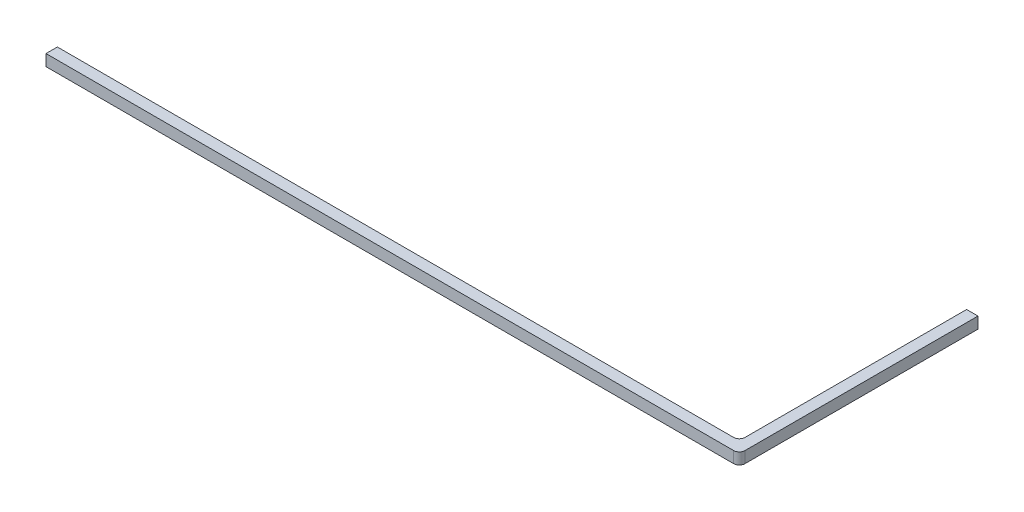
ISO-10303-21;
HEADER;
FILE_DESCRIPTION(('STEP AP214'),'2;1');
FILE_NAME('part.step','',(''),(''),'','','');
FILE_SCHEMA(('AUTOMOTIVE_DESIGN { 1 0 10303 214 1 1 1 1 }'));
ENDSEC;
DATA;
#1=APPLICATION_CONTEXT('core data for automotive mechanical design processes');
#2=APPLICATION_PROTOCOL_DEFINITION('international standard','automotive_design',2000,#1);
#3=PRODUCT_CONTEXT('',#1,'mechanical');
#4=PRODUCT('Part','Part','',(#3));
#5=PRODUCT_RELATED_PRODUCT_CATEGORY('part','',(#4));
#6=PRODUCT_DEFINITION_FORMATION('','',#4);
#7=PRODUCT_DEFINITION_CONTEXT('part definition',#1,'design');
#8=PRODUCT_DEFINITION('design','',#6,#7);
#9=PRODUCT_DEFINITION_SHAPE('','',#8);
#10=(LENGTH_UNIT() NAMED_UNIT(*) SI_UNIT(.MILLI.,.METRE.));
#11=(NAMED_UNIT(*) PLANE_ANGLE_UNIT() SI_UNIT($,.RADIAN.));
#12=(NAMED_UNIT(*) SI_UNIT($,.STERADIAN.) SOLID_ANGLE_UNIT());
#13=UNCERTAINTY_MEASURE_WITH_UNIT(LENGTH_MEASURE(1.E-05),#10,'distance_accuracy_value','');
#14=(GEOMETRIC_REPRESENTATION_CONTEXT(3) GLOBAL_UNCERTAINTY_ASSIGNED_CONTEXT((#13)) GLOBAL_UNIT_ASSIGNED_CONTEXT((#10,
#11,#12)) REPRESENTATION_CONTEXT('',''));
#15=CARTESIAN_POINT('',(0.,0.,0.));
#16=DIRECTION('',(0.,0.,1.));
#17=DIRECTION('',(1.,0.,0.));
#18=AXIS2_PLACEMENT_3D('',#15,#16,#17);
#19=CARTESIAN_POINT('',(0.,10.,0.));
#20=DIRECTION('',(1.,0.,0.));
#21=DIRECTION('',(0.,0.,-1.));
#22=AXIS2_PLACEMENT_3D('',#19,#20,#21);
#23=PLANE('',#22);
#24=DIRECTION('',(0.,0.,1.));
#25=VECTOR('',#24,1.);
#26=CARTESIAN_POINT('',(0.,0.,0.));
#27=LINE('',#26,#25);
#28=CARTESIAN_POINT('',(0.,0.,0.));
#29=VERTEX_POINT('',#28);
#30=CARTESIAN_POINT('',(0.,0.,10.));
#31=VERTEX_POINT('',#30);
#32=EDGE_CURVE('E116',#29,#31,#27,.T.);
#33=ORIENTED_EDGE('',*,*,#32,.T.);
#34=DIRECTION('',(0.,-1.,0.));
#35=VECTOR('',#34,1.);
#36=CARTESIAN_POINT('',(0.,10.,10.));
#37=LINE('',#36,#35);
#38=CARTESIAN_POINT('',(0.,10.,10.));
#39=VERTEX_POINT('',#38);
#40=EDGE_CURVE('E99',#39,#31,#37,.T.);
#41=ORIENTED_EDGE('',*,*,#40,.F.);
#42=DIRECTION('',(0.,0.,1.));
#43=VECTOR('',#42,1.);
#44=CARTESIAN_POINT('',(0.,10.,0.));
#45=LINE('',#44,#43);
#46=CARTESIAN_POINT('',(0.,10.,0.));
#47=VERTEX_POINT('',#46);
#48=EDGE_CURVE('E104',#47,#39,#45,.T.);
#49=ORIENTED_EDGE('',*,*,#48,.F.);
#50=DIRECTION('',(0.,-1.,0.));
#51=VECTOR('',#50,1.);
#52=CARTESIAN_POINT('',(0.,10.,0.));
#53=LINE('',#52,#51);
#54=EDGE_CURVE('E157',#47,#29,#53,.T.);
#55=ORIENTED_EDGE('',*,*,#54,.T.);
#56=EDGE_LOOP('',(#33,#41,#49,#55));
#57=FACE_BOUND('',#56,.T.);
#58=ADVANCED_FACE('F34',(#57),#23,.F.);
#59=CARTESIAN_POINT('',(600.,10.,10.));
#60=DIRECTION('',(0.,0.,-1.));
#61=DIRECTION('',(-1.,0.,0.));
#62=AXIS2_PLACEMENT_3D('',#59,#60,#61);
#63=PLANE('',#62);
#64=DIRECTION('',(1.,0.,0.));
#65=VECTOR('',#64,1.);
#66=CARTESIAN_POINT('',(600.,0.,10.));
#67=LINE('',#66,#65);
#68=CARTESIAN_POINT('',(605.,0.,10.));
#69=VERTEX_POINT('',#68);
#70=EDGE_CURVE('E147',#31,#69,#67,.T.);
#71=ORIENTED_EDGE('',*,*,#70,.T.);
#72=DIRECTION('',(0.,-1.,0.));
#73=VECTOR('',#72,1.);
#74=CARTESIAN_POINT('',(605.,10.,10.));
#75=LINE('',#74,#73);
#76=CARTESIAN_POINT('',(605.,10.,10.));
#77=VERTEX_POINT('',#76);
#78=EDGE_CURVE('E42',#69,#77,#75,.F.);
#79=ORIENTED_EDGE('',*,*,#78,.T.);
#80=DIRECTION('',(1.,0.,0.));
#81=VECTOR('',#80,1.);
#82=CARTESIAN_POINT('',(0.,10.,10.));
#83=LINE('',#82,#81);
#84=EDGE_CURVE('E95',#39,#77,#83,.T.);
#85=ORIENTED_EDGE('',*,*,#84,.F.);
#86=ORIENTED_EDGE('',*,*,#40,.T.);
#87=EDGE_LOOP('',(#71,#79,#85,#86));
#88=FACE_BOUND('',#87,.T.);
#89=ADVANCED_FACE('F97',(#88),#63,.F.);
#90=CARTESIAN_POINT('',(610.,10.,10.));
#91=DIRECTION('',(-1.,0.,0.));
#92=DIRECTION('',(0.,0.,1.));
#93=AXIS2_PLACEMENT_3D('',#90,#91,#92);
#94=PLANE('',#93);
#95=DIRECTION('',(0.,0.,-1.));
#96=VECTOR('',#95,1.);
#97=CARTESIAN_POINT('',(610.,10.,10.));
#98=LINE('',#97,#96);
#99=CARTESIAN_POINT('',(610.,10.,5.));
#100=VERTEX_POINT('',#99);
#101=CARTESIAN_POINT('',(610.,10.,-200.));
#102=VERTEX_POINT('',#101);
#103=EDGE_CURVE('E103',#100,#102,#98,.T.);
#104=ORIENTED_EDGE('',*,*,#103,.F.);
#105=DIRECTION('',(0.,-1.,0.));
#106=VECTOR('',#105,1.);
#107=CARTESIAN_POINT('',(610.,10.,5.));
#108=LINE('',#107,#106);
#109=CARTESIAN_POINT('',(610.,0.,5.));
#110=VERTEX_POINT('',#109);
#111=EDGE_CURVE('E133',#100,#110,#108,.T.);
#112=ORIENTED_EDGE('',*,*,#111,.T.);
#113=DIRECTION('',(0.,0.,-1.));
#114=VECTOR('',#113,1.);
#115=CARTESIAN_POINT('',(610.,0.,10.));
#116=LINE('',#115,#114);
#117=CARTESIAN_POINT('',(610.,0.,-200.));
#118=VERTEX_POINT('',#117);
#119=EDGE_CURVE('E141',#110,#118,#116,.T.);
#120=ORIENTED_EDGE('',*,*,#119,.T.);
#121=DIRECTION('',(0.,-1.,0.));
#122=VECTOR('',#121,1.);
#123=CARTESIAN_POINT('',(610.,10.,-200.));
#124=LINE('',#123,#122);
#125=EDGE_CURVE('E118',#102,#118,#124,.T.);
#126=ORIENTED_EDGE('',*,*,#125,.F.);
#127=EDGE_LOOP('',(#104,#112,#120,#126));
#128=FACE_BOUND('',#127,.T.);
#129=ADVANCED_FACE('F139',(#128),#94,.F.);
#130=CARTESIAN_POINT('',(600.,10.,-200.));
#131=DIRECTION('',(0.,0.,1.));
#132=DIRECTION('',(1.,0.,0.));
#133=AXIS2_PLACEMENT_3D('',#130,#131,#132);
#134=PLANE('',#133);
#135=DIRECTION('',(-1.,0.,0.));
#136=VECTOR('',#135,1.);
#137=CARTESIAN_POINT('',(600.,0.,-200.));
#138=LINE('',#137,#136);
#139=CARTESIAN_POINT('',(600.,0.,-200.));
#140=VERTEX_POINT('',#139);
#141=EDGE_CURVE('E146',#118,#140,#138,.T.);
#142=ORIENTED_EDGE('',*,*,#141,.T.);
#143=DIRECTION('',(0.,-1.,0.));
#144=VECTOR('',#143,1.);
#145=CARTESIAN_POINT('',(600.,10.,-200.));
#146=LINE('',#145,#144);
#147=CARTESIAN_POINT('',(600.,10.,-200.));
#148=VERTEX_POINT('',#147);
#149=EDGE_CURVE('E124',#148,#140,#146,.T.);
#150=ORIENTED_EDGE('',*,*,#149,.F.);
#151=DIRECTION('',(-1.,0.,0.));
#152=VECTOR('',#151,1.);
#153=CARTESIAN_POINT('',(600.,10.,-200.));
#154=LINE('',#153,#152);
#155=EDGE_CURVE('E176',#102,#148,#154,.T.);
#156=ORIENTED_EDGE('',*,*,#155,.F.);
#157=ORIENTED_EDGE('',*,*,#125,.T.);
#158=EDGE_LOOP('',(#142,#150,#156,#157));
#159=FACE_BOUND('',#158,.T.);
#160=ADVANCED_FACE('F180',(#159),#134,.F.);
#161=CARTESIAN_POINT('',(600.,10.,0.));
#162=DIRECTION('',(1.,0.,0.));
#163=DIRECTION('',(0.,0.,-1.));
#164=AXIS2_PLACEMENT_3D('',#161,#162,#163);
#165=PLANE('',#164);
#166=DIRECTION('',(0.,0.,1.));
#167=VECTOR('',#166,1.);
#168=CARTESIAN_POINT('',(600.,0.,0.));
#169=LINE('',#168,#167);
#170=CARTESIAN_POINT('',(600.,0.,-5.));
#171=VERTEX_POINT('',#170);
#172=EDGE_CURVE('E149',#140,#171,#169,.T.);
#173=ORIENTED_EDGE('',*,*,#172,.T.);
#174=DIRECTION('',(0.,-1.,0.));
#175=VECTOR('',#174,1.);
#176=CARTESIAN_POINT('',(600.,10.,-5.));
#177=LINE('',#176,#175);
#178=CARTESIAN_POINT('',(600.,10.,-5.));
#179=VERTEX_POINT('',#178);
#180=EDGE_CURVE('E121',#171,#179,#177,.F.);
#181=ORIENTED_EDGE('',*,*,#180,.T.);
#182=DIRECTION('',(0.,0.,1.));
#183=VECTOR('',#182,1.);
#184=CARTESIAN_POINT('',(600.,10.,0.));
#185=LINE('',#184,#183);
#186=EDGE_CURVE('E165',#148,#179,#185,.T.);
#187=ORIENTED_EDGE('',*,*,#186,.F.);
#188=ORIENTED_EDGE('',*,*,#149,.T.);
#189=EDGE_LOOP('',(#173,#181,#187,#188));
#190=FACE_BOUND('',#189,.T.);
#191=ADVANCED_FACE('F162',(#190),#165,.F.);
#192=CARTESIAN_POINT('',(0.,10.,0.));
#193=DIRECTION('',(0.,0.,1.));
#194=DIRECTION('',(1.,0.,0.));
#195=AXIS2_PLACEMENT_3D('',#192,#193,#194);
#196=PLANE('',#195);
#197=DIRECTION('',(-1.,0.,0.));
#198=VECTOR('',#197,1.);
#199=CARTESIAN_POINT('',(0.,10.,0.));
#200=LINE('',#199,#198);
#201=CARTESIAN_POINT('',(595.,10.,0.));
#202=VERTEX_POINT('',#201);
#203=EDGE_CURVE('E109',#202,#47,#200,.T.);
#204=ORIENTED_EDGE('',*,*,#203,.F.);
#205=DIRECTION('',(0.,-1.,0.));
#206=VECTOR('',#205,1.);
#207=CARTESIAN_POINT('',(595.,0.,0.));
#208=LINE('',#207,#206);
#209=CARTESIAN_POINT('',(595.,0.,0.));
#210=VERTEX_POINT('',#209);
#211=EDGE_CURVE('E117',#202,#210,#208,.T.);
#212=ORIENTED_EDGE('',*,*,#211,.T.);
#213=DIRECTION('',(-1.,0.,0.));
#214=VECTOR('',#213,1.);
#215=CARTESIAN_POINT('',(0.,0.,0.));
#216=LINE('',#215,#214);
#217=EDGE_CURVE('E113',#210,#29,#216,.T.);
#218=ORIENTED_EDGE('',*,*,#217,.T.);
#219=ORIENTED_EDGE('',*,*,#54,.F.);
#220=EDGE_LOOP('',(#204,#212,#218,#219));
#221=FACE_BOUND('',#220,.T.);
#222=ADVANCED_FACE('F174',(#221),#196,.F.);
#223=CARTESIAN_POINT('',(0.,10.,0.));
#224=DIRECTION('',(0.,1.,0.));
#225=DIRECTION('',(0.,0.,1.));
#226=AXIS2_PLACEMENT_3D('',#223,#224,#225);
#227=PLANE('',#226);
#228=ORIENTED_EDGE('',*,*,#84,.T.);
#229=CARTESIAN_POINT('',(605.,10.,5.));
#230=DIRECTION('',(0.,1.,0.));
#231=DIRECTION('',(0.,0.,1.));
#232=AXIS2_PLACEMENT_3D('',#229,#230,#231);
#233=CIRCLE('',#232,5.);
#234=EDGE_CURVE('E11',#77,#100,#233,.T.);
#235=ORIENTED_EDGE('',*,*,#234,.T.);
#236=ORIENTED_EDGE('',*,*,#103,.T.);
#237=ORIENTED_EDGE('',*,*,#155,.T.);
#238=ORIENTED_EDGE('',*,*,#186,.T.);
#239=CARTESIAN_POINT('',(595.,10.,-5.));
#240=DIRECTION('',(0.,1.,0.));
#241=DIRECTION('',(0.,0.,1.));
#242=AXIS2_PLACEMENT_3D('',#239,#240,#241);
#243=CIRCLE('',#242,5.);
#244=EDGE_CURVE('E131',#179,#202,#243,.F.);
#245=ORIENTED_EDGE('',*,*,#244,.T.);
#246=ORIENTED_EDGE('',*,*,#203,.T.);
#247=ORIENTED_EDGE('',*,*,#48,.T.);
#248=EDGE_LOOP('',(#228,#235,#236,#237,#238,#245,#246,#247));
#249=FACE_BOUND('',#248,.T.);
#250=ADVANCED_FACE('F107',(#249),#227,.T.);
#251=CARTESIAN_POINT('',(0.,0.,0.));
#252=DIRECTION('',(0.,1.,0.));
#253=DIRECTION('',(0.,0.,1.));
#254=AXIS2_PLACEMENT_3D('',#251,#252,#253);
#255=PLANE('',#254);
#256=ORIENTED_EDGE('',*,*,#119,.F.);
#257=CARTESIAN_POINT('',(605.,0.,5.));
#258=DIRECTION('',(0.,1.,0.));
#259=DIRECTION('',(0.,0.,1.));
#260=AXIS2_PLACEMENT_3D('',#257,#258,#259);
#261=CIRCLE('',#260,5.);
#262=EDGE_CURVE('E56',#110,#69,#261,.F.);
#263=ORIENTED_EDGE('',*,*,#262,.T.);
#264=ORIENTED_EDGE('',*,*,#70,.F.);
#265=ORIENTED_EDGE('',*,*,#32,.F.);
#266=ORIENTED_EDGE('',*,*,#217,.F.);
#267=CARTESIAN_POINT('',(595.,0.,-5.));
#268=DIRECTION('',(0.,1.,0.));
#269=DIRECTION('',(0.,0.,1.));
#270=AXIS2_PLACEMENT_3D('',#267,#268,#269);
#271=CIRCLE('',#270,5.);
#272=EDGE_CURVE('E129',#210,#171,#271,.T.);
#273=ORIENTED_EDGE('',*,*,#272,.T.);
#274=ORIENTED_EDGE('',*,*,#172,.F.);
#275=ORIENTED_EDGE('',*,*,#141,.F.);
#276=EDGE_LOOP('',(#256,#263,#264,#265,#266,#273,#274,#275));
#277=FACE_BOUND('',#276,.T.);
#278=ADVANCED_FACE('F144',(#277),#255,.F.);
#279=CARTESIAN_POINT('',(595.,10.,-5.));
#280=DIRECTION('',(0.,1.,0.));
#281=DIRECTION('',(0.,0.,1.));
#282=AXIS2_PLACEMENT_3D('',#279,#280,#281);
#283=CYLINDRICAL_SURFACE('',#282,5.);
#284=ORIENTED_EDGE('',*,*,#244,.F.);
#285=ORIENTED_EDGE('',*,*,#180,.F.);
#286=ORIENTED_EDGE('',*,*,#272,.F.);
#287=ORIENTED_EDGE('',*,*,#211,.F.);
#288=EDGE_LOOP('',(#284,#285,#286,#287));
#289=FACE_BOUND('',#288,.T.);
#290=ADVANCED_FACE('F172',(#289),#283,.F.);
#291=CARTESIAN_POINT('',(605.,10.,5.));
#292=DIRECTION('',(0.,-1.,0.));
#293=DIRECTION('',(0.,0.,-1.));
#294=AXIS2_PLACEMENT_3D('',#291,#292,#293);
#295=CYLINDRICAL_SURFACE('',#294,5.);
#296=ORIENTED_EDGE('',*,*,#234,.F.);
#297=ORIENTED_EDGE('',*,*,#78,.F.);
#298=ORIENTED_EDGE('',*,*,#262,.F.);
#299=ORIENTED_EDGE('',*,*,#111,.F.);
#300=EDGE_LOOP('',(#296,#297,#298,#299));
#301=FACE_BOUND('',#300,.T.);
#302=ADVANCED_FACE('F36',(#301),#295,.T.);
#303=CLOSED_SHELL('',(#58,#89,#129,#160,#191,#222,#250,#278,#290,#302));
#304=MANIFOLD_SOLID_BREP('B2',#303);
#305=ADVANCED_BREP_SHAPE_REPRESENTATION('',(#18,#304),#14);
#306=SHAPE_DEFINITION_REPRESENTATION(#9,#305);
ENDSEC;
END-ISO-10303-21;
